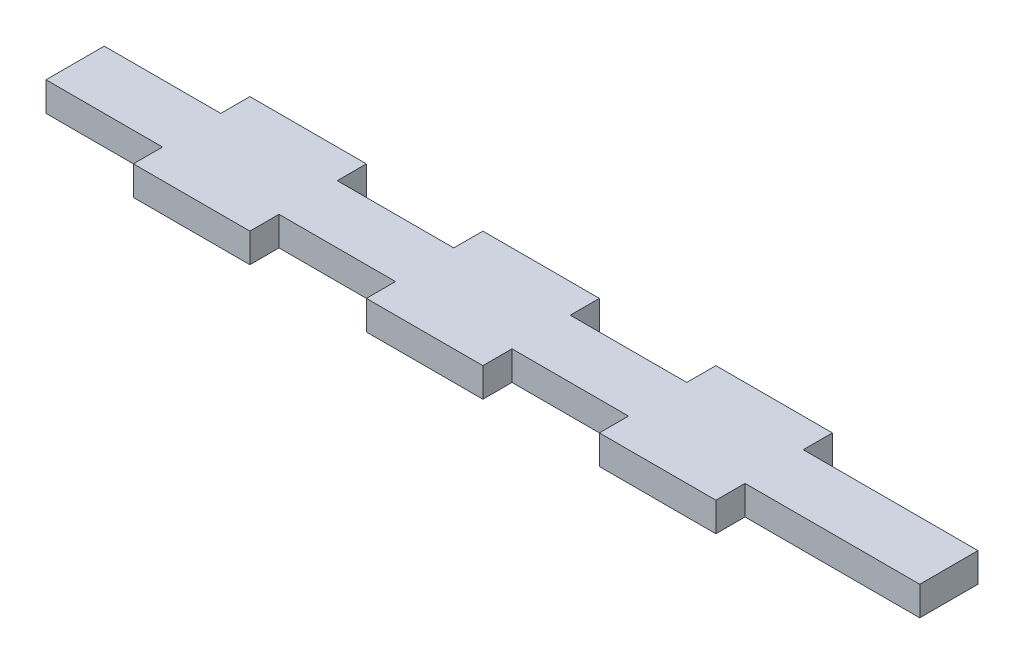
ISO-10303-21;
HEADER;
FILE_DESCRIPTION(('STEP AP214'),'2;1');
FILE_NAME('part.step','',(''),(''),'','','');
FILE_SCHEMA(('AUTOMOTIVE_DESIGN { 1 0 10303 214 1 1 1 1 }'));
ENDSEC;
DATA;
#1=APPLICATION_CONTEXT('core data for automotive mechanical design processes');
#2=APPLICATION_PROTOCOL_DEFINITION('international standard','automotive_design',2000,#1);
#3=PRODUCT_CONTEXT('',#1,'mechanical');
#4=PRODUCT('Part','Part','',(#3));
#5=PRODUCT_RELATED_PRODUCT_CATEGORY('part','',(#4));
#6=PRODUCT_DEFINITION_FORMATION('','',#4);
#7=PRODUCT_DEFINITION_CONTEXT('part definition',#1,'design');
#8=PRODUCT_DEFINITION('design','',#6,#7);
#9=PRODUCT_DEFINITION_SHAPE('','',#8);
#10=(LENGTH_UNIT() NAMED_UNIT(*) SI_UNIT(.MILLI.,.METRE.));
#11=(NAMED_UNIT(*) PLANE_ANGLE_UNIT() SI_UNIT($,.RADIAN.));
#12=(NAMED_UNIT(*) SI_UNIT($,.STERADIAN.) SOLID_ANGLE_UNIT());
#13=UNCERTAINTY_MEASURE_WITH_UNIT(LENGTH_MEASURE(1.E-05),#10,'distance_accuracy_value','');
#14=(GEOMETRIC_REPRESENTATION_CONTEXT(3) GLOBAL_UNCERTAINTY_ASSIGNED_CONTEXT((#13)) GLOBAL_UNIT_ASSIGNED_CONTEXT((#10,
#11,#12)) REPRESENTATION_CONTEXT('',''));
#15=CARTESIAN_POINT('',(0.,0.,0.));
#16=DIRECTION('',(0.,0.,1.));
#17=DIRECTION('',(1.,0.,0.));
#18=AXIS2_PLACEMENT_3D('',#15,#16,#17);
#19=CARTESIAN_POINT('',(0.,0.,12.7));
#20=DIRECTION('',(0.,0.,1.));
#21=DIRECTION('',(1.,0.,0.));
#22=AXIS2_PLACEMENT_3D('',#19,#20,#21);
#23=PLANE('',#22);
#24=DIRECTION('',(0.,1.,0.));
#25=VECTOR('',#24,1.);
#26=CARTESIAN_POINT('',(1.71947391196867,-7.93749999999999,12.7));
#27=LINE('',#26,#25);
#28=CARTESIAN_POINT('',(1.71947391196867,-14.2875,12.7));
#29=VERTEX_POINT('',#28);
#30=CARTESIAN_POINT('',(1.71947391196867,-7.93749999999997,12.7));
#31=VERTEX_POINT('',#30);
#32=EDGE_CURVE('E109',#29,#31,#27,.T.);
#33=ORIENTED_EDGE('',*,*,#32,.T.);
#34=DIRECTION('',(-1.,0.,0.));
#35=VECTOR('',#34,1.);
#36=CARTESIAN_POINT('',(65.2194739119687,-7.93749999999996,12.7));
#37=LINE('',#36,#35);
#38=CARTESIAN_POINT('',(-23.6805260880313,-7.93749999999997,12.7));
#39=VERTEX_POINT('',#38);
#40=EDGE_CURVE('E95',#31,#39,#37,.T.);
#41=ORIENTED_EDGE('',*,*,#40,.T.);
#42=DIRECTION('',(0.,-1.,0.));
#43=VECTOR('',#42,1.);
#44=CARTESIAN_POINT('',(-23.6805260880313,-7.93749999999998,12.7));
#45=LINE('',#44,#43);
#46=CARTESIAN_POINT('',(-23.6805260880313,-14.2875,12.7));
#47=VERTEX_POINT('',#46);
#48=EDGE_CURVE('E320',#39,#47,#45,.T.);
#49=ORIENTED_EDGE('',*,*,#48,.T.);
#50=DIRECTION('',(1.,0.,0.));
#51=VECTOR('',#50,1.);
#52=CARTESIAN_POINT('',(65.2194739119687,-14.2875,12.7));
#53=LINE('',#52,#51);
#54=EDGE_CURVE('E375',#47,#29,#53,.T.);
#55=ORIENTED_EDGE('',*,*,#54,.T.);
#56=EDGE_LOOP('',(#33,#41,#49,#55));
#57=FACE_BOUND('',#56,.T.);
#58=ADVANCED_FACE('F91',(#57),#23,.T.);
#59=DIRECTION('',(0.,1.,0.));
#60=VECTOR('',#59,1.);
#61=CARTESIAN_POINT('',(-49.0805260880313,-7.93749999999998,12.7));
#62=LINE('',#61,#60);
#63=CARTESIAN_POINT('',(-49.0805260880313,-14.2875,12.7));
#64=VERTEX_POINT('',#63);
#65=CARTESIAN_POINT('',(-49.0805260880313,-7.93749999999998,12.7));
#66=VERTEX_POINT('',#65);
#67=EDGE_CURVE('E288',#64,#66,#62,.T.);
#68=ORIENTED_EDGE('',*,*,#67,.T.);
#69=CARTESIAN_POINT('',(-74.4805260880313,-7.93749999999997,12.7));
#70=VERTEX_POINT('',#69);
#71=EDGE_CURVE('E380',#66,#70,#37,.T.);
#72=ORIENTED_EDGE('',*,*,#71,.T.);
#73=DIRECTION('',(0.,-1.,0.));
#74=VECTOR('',#73,1.);
#75=CARTESIAN_POINT('',(-74.4805260880313,-7.93749999999997,12.7));
#76=LINE('',#75,#74);
#77=CARTESIAN_POINT('',(-74.4805260880313,-14.2875,12.7));
#78=VERTEX_POINT('',#77);
#79=EDGE_CURVE('E349',#70,#78,#76,.T.);
#80=ORIENTED_EDGE('',*,*,#79,.T.);
#81=EDGE_CURVE('E378',#78,#64,#53,.T.);
#82=ORIENTED_EDGE('',*,*,#81,.T.);
#83=EDGE_LOOP('',(#68,#72,#80,#82));
#84=FACE_BOUND('',#83,.T.);
#85=ADVANCED_FACE('F619',(#84),#23,.T.);
#86=CARTESIAN_POINT('',(-125.280526088031,-14.2875,12.7));
#87=VERTEX_POINT('',#86);
#88=CARTESIAN_POINT('',(-99.8805260880313,-14.2875,12.7));
#89=VERTEX_POINT('',#88);
#90=EDGE_CURVE('E393',#87,#89,#53,.T.);
#91=ORIENTED_EDGE('',*,*,#90,.T.);
#92=DIRECTION('',(0.,1.,0.));
#93=VECTOR('',#92,1.);
#94=CARTESIAN_POINT('',(-99.8805260880313,-7.93749999999996,12.7));
#95=LINE('',#94,#93);
#96=CARTESIAN_POINT('',(-99.8805260880313,-7.93749999999996,12.7));
#97=VERTEX_POINT('',#96);
#98=EDGE_CURVE('E344',#89,#97,#95,.T.);
#99=ORIENTED_EDGE('',*,*,#98,.T.);
#100=CARTESIAN_POINT('',(-125.280526088031,-7.93749999999999,12.7));
#101=VERTEX_POINT('',#100);
#102=EDGE_CURVE('E397',#97,#101,#37,.T.);
#103=ORIENTED_EDGE('',*,*,#102,.T.);
#104=DIRECTION('',(0.,-1.,0.));
#105=VECTOR('',#104,1.);
#106=CARTESIAN_POINT('',(-125.280526088031,-14.2875,12.7));
#107=LINE('',#106,#105);
#108=EDGE_CURVE('E384',#101,#87,#107,.T.);
#109=ORIENTED_EDGE('',*,*,#108,.T.);
#110=EDGE_LOOP('',(#91,#99,#103,#109));
#111=FACE_BOUND('',#110,.T.);
#112=ADVANCED_FACE('F593',(#111),#23,.T.);
#113=DIRECTION('',(0.,-1.,0.));
#114=VECTOR('',#113,1.);
#115=CARTESIAN_POINT('',(27.1194739119687,-7.93749999999999,12.7));
#116=LINE('',#115,#114);
#117=CARTESIAN_POINT('',(27.1194739119687,-7.93749999999997,12.7));
#118=VERTEX_POINT('',#117);
#119=CARTESIAN_POINT('',(27.1194739119687,-14.2875,12.7));
#120=VERTEX_POINT('',#119);
#121=EDGE_CURVE('E299',#118,#120,#116,.T.);
#122=ORIENTED_EDGE('',*,*,#121,.T.);
#123=CARTESIAN_POINT('',(65.2194739119687,-14.2875,12.7));
#124=VERTEX_POINT('',#123);
#125=EDGE_CURVE('E379',#120,#124,#53,.T.);
#126=ORIENTED_EDGE('',*,*,#125,.T.);
#127=DIRECTION('',(0.,1.,0.));
#128=VECTOR('',#127,1.);
#129=CARTESIAN_POINT('',(65.2194739119687,-14.2875,12.7));
#130=LINE('',#129,#128);
#131=CARTESIAN_POINT('',(65.2194739119687,-7.93749999999996,12.7));
#132=VERTEX_POINT('',#131);
#133=EDGE_CURVE('E399',#124,#132,#130,.T.);
#134=ORIENTED_EDGE('',*,*,#133,.T.);
#135=EDGE_CURVE('E117',#132,#118,#37,.T.);
#136=ORIENTED_EDGE('',*,*,#135,.T.);
#137=EDGE_LOOP('',(#122,#126,#134,#136));
#138=FACE_BOUND('',#137,.T.);
#139=ADVANCED_FACE('F591',(#138),#23,.T.);
#140=CARTESIAN_POINT('',(0.,0.,0.));
#141=DIRECTION('',(0.,0.,1.));
#142=DIRECTION('',(1.,0.,0.));
#143=AXIS2_PLACEMENT_3D('',#140,#141,#142);
#144=PLANE('',#143);
#145=DIRECTION('',(0.,1.,0.));
#146=VECTOR('',#145,1.);
#147=CARTESIAN_POINT('',(1.71947391196867,-7.93749999999995,0.));
#148=LINE('',#147,#146);
#149=CARTESIAN_POINT('',(1.71947391196867,-14.2875,0.));
#150=VERTEX_POINT('',#149);
#151=CARTESIAN_POINT('',(1.71947391196867,-7.93749999999995,0.));
#152=VERTEX_POINT('',#151);
#153=EDGE_CURVE('E371',#150,#152,#148,.T.);
#154=ORIENTED_EDGE('',*,*,#153,.F.);
#155=DIRECTION('',(1.,0.,0.));
#156=VECTOR('',#155,1.);
#157=CARTESIAN_POINT('',(65.2194739119687,-14.2875,0.));
#158=LINE('',#157,#156);
#159=CARTESIAN_POINT('',(-23.6805260880313,-14.2875,0.));
#160=VERTEX_POINT('',#159);
#161=EDGE_CURVE('E445',#160,#150,#158,.T.);
#162=ORIENTED_EDGE('',*,*,#161,.F.);
#163=DIRECTION('',(0.,-1.,0.));
#164=VECTOR('',#163,1.);
#165=CARTESIAN_POINT('',(-23.6805260880313,-7.93749999999996,0.));
#166=LINE('',#165,#164);
#167=CARTESIAN_POINT('',(-23.6805260880313,-7.93749999999996,0.));
#168=VERTEX_POINT('',#167);
#169=EDGE_CURVE('E531',#168,#160,#166,.T.);
#170=ORIENTED_EDGE('',*,*,#169,.F.);
#171=DIRECTION('',(-1.,0.,0.));
#172=VECTOR('',#171,1.);
#173=CARTESIAN_POINT('',(65.2194739119687,-7.93749999999996,0.));
#174=LINE('',#173,#172);
#175=EDGE_CURVE('E485',#152,#168,#174,.T.);
#176=ORIENTED_EDGE('',*,*,#175,.F.);
#177=EDGE_LOOP('',(#154,#162,#170,#176));
#178=FACE_BOUND('',#177,.T.);
#179=ADVANCED_FACE('F568',(#178),#144,.F.);
#180=DIRECTION('',(0.,-1.,0.));
#181=VECTOR('',#180,1.);
#182=CARTESIAN_POINT('',(27.1194739119687,-7.93749999999995,0.));
#183=LINE('',#182,#181);
#184=CARTESIAN_POINT('',(27.1194739119687,-7.93749999999995,0.));
#185=VERTEX_POINT('',#184);
#186=CARTESIAN_POINT('',(27.1194739119687,-14.2875,0.));
#187=VERTEX_POINT('',#186);
#188=EDGE_CURVE('E572',#185,#187,#183,.T.);
#189=ORIENTED_EDGE('',*,*,#188,.F.);
#190=CARTESIAN_POINT('',(65.2194739119687,-7.93749999999996,0.));
#191=VERTEX_POINT('',#190);
#192=EDGE_CURVE('E482',#191,#185,#174,.T.);
#193=ORIENTED_EDGE('',*,*,#192,.F.);
#194=DIRECTION('',(0.,1.,0.));
#195=VECTOR('',#194,1.);
#196=CARTESIAN_POINT('',(65.2194739119687,-14.2875,0.));
#197=LINE('',#196,#195);
#198=CARTESIAN_POINT('',(65.2194739119687,-14.2875,0.));
#199=VERTEX_POINT('',#198);
#200=EDGE_CURVE('E385',#199,#191,#197,.T.);
#201=ORIENTED_EDGE('',*,*,#200,.F.);
#202=EDGE_CURVE('E450',#187,#199,#158,.T.);
#203=ORIENTED_EDGE('',*,*,#202,.F.);
#204=EDGE_LOOP('',(#189,#193,#201,#203));
#205=FACE_BOUND('',#204,.T.);
#206=ADVANCED_FACE('F480',(#205),#144,.F.);
#207=DIRECTION('',(0.,1.,0.));
#208=VECTOR('',#207,1.);
#209=CARTESIAN_POINT('',(-49.0805260880313,-7.93749999999996,0.));
#210=LINE('',#209,#208);
#211=CARTESIAN_POINT('',(-49.0805260880313,-14.2875,0.));
#212=VERTEX_POINT('',#211);
#213=CARTESIAN_POINT('',(-49.0805260880313,-7.93749999999996,0.));
#214=VERTEX_POINT('',#213);
#215=EDGE_CURVE('E528',#212,#214,#210,.T.);
#216=ORIENTED_EDGE('',*,*,#215,.F.);
#217=CARTESIAN_POINT('',(-74.4805260880313,-14.2875,0.));
#218=VERTEX_POINT('',#217);
#219=EDGE_CURVE('E449',#218,#212,#158,.T.);
#220=ORIENTED_EDGE('',*,*,#219,.F.);
#221=DIRECTION('',(0.,-1.,0.));
#222=VECTOR('',#221,1.);
#223=CARTESIAN_POINT('',(-74.4805260880313,-7.93749999999997,0.));
#224=LINE('',#223,#222);
#225=CARTESIAN_POINT('',(-74.4805260880313,-7.93749999999998,0.));
#226=VERTEX_POINT('',#225);
#227=EDGE_CURVE('E413',#226,#218,#224,.T.);
#228=ORIENTED_EDGE('',*,*,#227,.F.);
#229=EDGE_CURVE('E451',#214,#226,#174,.T.);
#230=ORIENTED_EDGE('',*,*,#229,.F.);
#231=EDGE_LOOP('',(#216,#220,#228,#230));
#232=FACE_BOUND('',#231,.T.);
#233=ADVANCED_FACE('F526',(#232),#144,.F.);
#234=DIRECTION('',(0.,1.,0.));
#235=VECTOR('',#234,1.);
#236=CARTESIAN_POINT('',(-99.8805260880313,-7.93749999999996,0.));
#237=LINE('',#236,#235);
#238=CARTESIAN_POINT('',(-99.8805260880313,-14.2875,0.));
#239=VERTEX_POINT('',#238);
#240=CARTESIAN_POINT('',(-99.8805260880313,-7.93749999999998,0.));
#241=VERTEX_POINT('',#240);
#242=EDGE_CURVE('E418',#239,#241,#237,.T.);
#243=ORIENTED_EDGE('',*,*,#242,.F.);
#244=CARTESIAN_POINT('',(-125.280526088031,-14.2875,0.));
#245=VERTEX_POINT('',#244);
#246=EDGE_CURVE('E407',#245,#239,#158,.T.);
#247=ORIENTED_EDGE('',*,*,#246,.F.);
#248=DIRECTION('',(0.,-1.,0.));
#249=VECTOR('',#248,1.);
#250=CARTESIAN_POINT('',(-125.280526088031,-14.2875,0.));
#251=LINE('',#250,#249);
#252=CARTESIAN_POINT('',(-125.280526088031,-7.93749999999999,0.));
#253=VERTEX_POINT('',#252);
#254=EDGE_CURVE('E456',#253,#245,#251,.T.);
#255=ORIENTED_EDGE('',*,*,#254,.F.);
#256=EDGE_CURVE('E419',#241,#253,#174,.T.);
#257=ORIENTED_EDGE('',*,*,#256,.F.);
#258=EDGE_LOOP('',(#243,#247,#255,#257));
#259=FACE_BOUND('',#258,.T.);
#260=ADVANCED_FACE('F501',(#259),#144,.F.);
#261=CARTESIAN_POINT('',(65.2194739119687,-14.2875,12.7));
#262=DIRECTION('',(-1.,0.,0.));
#263=DIRECTION('',(0.,0.,1.));
#264=AXIS2_PLACEMENT_3D('',#261,#262,#263);
#265=PLANE('',#264);
#266=ORIENTED_EDGE('',*,*,#200,.T.);
#267=DIRECTION('',(0.,0.,-1.));
#268=VECTOR('',#267,1.);
#269=CARTESIAN_POINT('',(65.2194739119687,-7.93749999999996,12.7));
#270=LINE('',#269,#268);
#271=EDGE_CURVE('E45',#132,#191,#270,.T.);
#272=ORIENTED_EDGE('',*,*,#271,.F.);
#273=ORIENTED_EDGE('',*,*,#133,.F.);
#274=DIRECTION('',(0.,0.,-1.));
#275=VECTOR('',#274,1.);
#276=CARTESIAN_POINT('',(65.2194739119687,-14.2875,12.7));
#277=LINE('',#276,#275);
#278=EDGE_CURVE('E396',#124,#199,#277,.T.);
#279=ORIENTED_EDGE('',*,*,#278,.T.);
#280=EDGE_LOOP('',(#266,#272,#273,#279));
#281=FACE_BOUND('',#280,.T.);
#282=ADVANCED_FACE('F93',(#281),#265,.F.);
#283=CARTESIAN_POINT('',(65.2194739119687,-7.93749999999996,12.7));
#284=DIRECTION('',(0.,-1.,0.));
#285=DIRECTION('',(1.,0.,0.));
#286=AXIS2_PLACEMENT_3D('',#283,#284,#285);
#287=PLANE('',#286);
#288=ORIENTED_EDGE('',*,*,#192,.T.);
#289=DIRECTION('',(0.,0.,1.));
#290=VECTOR('',#289,1.);
#291=CARTESIAN_POINT('',(27.1194739119687,-7.93749999999995,-6.35));
#292=LINE('',#291,#290);
#293=CARTESIAN_POINT('',(27.1194739119687,-7.93749999999995,-6.35));
#294=VERTEX_POINT('',#293);
#295=EDGE_CURVE('E537',#294,#185,#292,.T.);
#296=ORIENTED_EDGE('',*,*,#295,.F.);
#297=DIRECTION('',(1.,0.,0.));
#298=VECTOR('',#297,1.);
#299=CARTESIAN_POINT('',(1.71947391196867,-7.93749999999995,-6.35));
#300=LINE('',#299,#298);
#301=CARTESIAN_POINT('',(1.71947391196867,-7.93749999999995,-6.35));
#302=VERTEX_POINT('',#301);
#303=EDGE_CURVE('E895',#302,#294,#300,.T.);
#304=ORIENTED_EDGE('',*,*,#303,.F.);
#305=DIRECTION('',(0.,0.,1.));
#306=VECTOR('',#305,1.);
#307=CARTESIAN_POINT('',(1.71947391196867,-7.93749999999995,-6.35));
#308=LINE('',#307,#306);
#309=EDGE_CURVE('E532',#302,#152,#308,.T.);
#310=ORIENTED_EDGE('',*,*,#309,.T.);
#311=ORIENTED_EDGE('',*,*,#175,.T.);
#312=DIRECTION('',(0.,0.,1.));
#313=VECTOR('',#312,1.);
#314=CARTESIAN_POINT('',(-23.6805260880313,-7.93749999999996,-6.35));
#315=LINE('',#314,#313);
#316=CARTESIAN_POINT('',(-23.6805260880313,-7.93749999999996,-6.35));
#317=VERTEX_POINT('',#316);
#318=EDGE_CURVE('E546',#317,#168,#315,.T.);
#319=ORIENTED_EDGE('',*,*,#318,.F.);
#320=DIRECTION('',(1.,0.,0.));
#321=VECTOR('',#320,1.);
#322=CARTESIAN_POINT('',(-49.0805260880313,-7.93749999999996,-6.35));
#323=LINE('',#322,#321);
#324=CARTESIAN_POINT('',(-49.0805260880313,-7.93749999999996,-6.35));
#325=VERTEX_POINT('',#324);
#326=EDGE_CURVE('E551',#325,#317,#323,.T.);
#327=ORIENTED_EDGE('',*,*,#326,.F.);
#328=DIRECTION('',(0.,0.,1.));
#329=VECTOR('',#328,1.);
#330=CARTESIAN_POINT('',(-49.0805260880313,-7.93749999999996,-6.35));
#331=LINE('',#330,#329);
#332=EDGE_CURVE('E439',#325,#214,#331,.T.);
#333=ORIENTED_EDGE('',*,*,#332,.T.);
#334=ORIENTED_EDGE('',*,*,#229,.T.);
#335=DIRECTION('',(0.,0.,1.));
#336=VECTOR('',#335,1.);
#337=CARTESIAN_POINT('',(-74.4805260880313,-7.93749999999997,-6.35));
#338=LINE('',#337,#336);
#339=CARTESIAN_POINT('',(-74.4805260880313,-7.93749999999997,-6.35));
#340=VERTEX_POINT('',#339);
#341=EDGE_CURVE('E424',#340,#226,#338,.T.);
#342=ORIENTED_EDGE('',*,*,#341,.F.);
#343=DIRECTION('',(1.,0.,0.));
#344=VECTOR('',#343,1.);
#345=CARTESIAN_POINT('',(-99.8805260880313,-7.93749999999996,-6.35));
#346=LINE('',#345,#344);
#347=CARTESIAN_POINT('',(-99.8805260880313,-7.93749999999996,-6.35));
#348=VERTEX_POINT('',#347);
#349=EDGE_CURVE('E510',#348,#340,#346,.T.);
#350=ORIENTED_EDGE('',*,*,#349,.F.);
#351=DIRECTION('',(0.,0.,1.));
#352=VECTOR('',#351,1.);
#353=CARTESIAN_POINT('',(-99.8805260880313,-7.93749999999996,-6.35));
#354=LINE('',#353,#352);
#355=EDGE_CURVE('E430',#348,#241,#354,.T.);
#356=ORIENTED_EDGE('',*,*,#355,.T.);
#357=ORIENTED_EDGE('',*,*,#256,.T.);
#358=DIRECTION('',(0.,0.,-1.));
#359=VECTOR('',#358,1.);
#360=CARTESIAN_POINT('',(-125.280526088031,-7.93749999999999,12.7));
#361=LINE('',#360,#359);
#362=EDGE_CURVE('E101',#101,#253,#361,.T.);
#363=ORIENTED_EDGE('',*,*,#362,.F.);
#364=ORIENTED_EDGE('',*,*,#102,.F.);
#365=DIRECTION('',(0.,0.,-1.));
#366=VECTOR('',#365,1.);
#367=CARTESIAN_POINT('',(-99.8805260880313,-7.93749999999996,19.05));
#368=LINE('',#367,#366);
#369=CARTESIAN_POINT('',(-99.8805260880313,-7.93749999999996,19.05));
#370=VERTEX_POINT('',#369);
#371=EDGE_CURVE('E358',#370,#97,#368,.T.);
#372=ORIENTED_EDGE('',*,*,#371,.F.);
#373=DIRECTION('',(1.,0.,0.));
#374=VECTOR('',#373,1.);
#375=CARTESIAN_POINT('',(-99.8805260880313,-7.93749999999996,19.05));
#376=LINE('',#375,#374);
#377=CARTESIAN_POINT('',(-74.4805260880313,-7.93749999999997,19.05));
#378=VERTEX_POINT('',#377);
#379=EDGE_CURVE('E355',#370,#378,#376,.T.);
#380=ORIENTED_EDGE('',*,*,#379,.T.);
#381=DIRECTION('',(0.,0.,-1.));
#382=VECTOR('',#381,1.);
#383=CARTESIAN_POINT('',(-74.4805260880313,-7.93749999999997,19.05));
#384=LINE('',#383,#382);
#385=EDGE_CURVE('E599',#378,#70,#384,.T.);
#386=ORIENTED_EDGE('',*,*,#385,.T.);
#387=ORIENTED_EDGE('',*,*,#71,.F.);
#388=DIRECTION('',(0.,0.,-1.));
#389=VECTOR('',#388,1.);
#390=CARTESIAN_POINT('',(-49.0805260880313,-7.93749999999998,19.05));
#391=LINE('',#390,#389);
#392=CARTESIAN_POINT('',(-49.0805260880313,-7.93749999999998,19.05));
#393=VERTEX_POINT('',#392);
#394=EDGE_CURVE('E329',#393,#66,#391,.T.);
#395=ORIENTED_EDGE('',*,*,#394,.F.);
#396=DIRECTION('',(1.,0.,0.));
#397=VECTOR('',#396,1.);
#398=CARTESIAN_POINT('',(-49.0805260880313,-7.93749999999998,19.05));
#399=LINE('',#398,#397);
#400=CARTESIAN_POINT('',(-23.6805260880313,-7.93749999999998,19.05));
#401=VERTEX_POINT('',#400);
#402=EDGE_CURVE('E326',#393,#401,#399,.T.);
#403=ORIENTED_EDGE('',*,*,#402,.T.);
#404=DIRECTION('',(0.,0.,-1.));
#405=VECTOR('',#404,1.);
#406=CARTESIAN_POINT('',(-23.6805260880313,-7.93749999999998,19.05));
#407=LINE('',#406,#405);
#408=EDGE_CURVE('E335',#401,#39,#407,.T.);
#409=ORIENTED_EDGE('',*,*,#408,.T.);
#410=ORIENTED_EDGE('',*,*,#40,.F.);
#411=DIRECTION('',(0.,0.,-1.));
#412=VECTOR('',#411,1.);
#413=CARTESIAN_POINT('',(1.71947391196867,-7.93749999999999,19.05));
#414=LINE('',#413,#412);
#415=CARTESIAN_POINT('',(1.71947391196867,-7.93749999999999,19.05));
#416=VERTEX_POINT('',#415);
#417=EDGE_CURVE('E309',#416,#31,#414,.T.);
#418=ORIENTED_EDGE('',*,*,#417,.F.);
#419=DIRECTION('',(1.,0.,0.));
#420=VECTOR('',#419,1.);
#421=CARTESIAN_POINT('',(1.71947391196867,-7.93749999999999,19.05));
#422=LINE('',#421,#420);
#423=CARTESIAN_POINT('',(27.1194739119687,-7.93749999999999,19.05));
#424=VERTEX_POINT('',#423);
#425=EDGE_CURVE('E298',#416,#424,#422,.T.);
#426=ORIENTED_EDGE('',*,*,#425,.T.);
#427=DIRECTION('',(0.,0.,-1.));
#428=VECTOR('',#427,1.);
#429=CARTESIAN_POINT('',(27.1194739119687,-7.93749999999999,19.05));
#430=LINE('',#429,#428);
#431=EDGE_CURVE('E313',#424,#118,#430,.T.);
#432=ORIENTED_EDGE('',*,*,#431,.T.);
#433=ORIENTED_EDGE('',*,*,#135,.F.);
#434=ORIENTED_EDGE('',*,*,#271,.T.);
#435=EDGE_LOOP('',(#288,#296,#304,#310,#311,#319,#327,#333,#334,#342,#350,#356,#357,#363,#364,
#372,#380,#386,#387,#395,#403,#409,#410,#418,#426,#432,#433,#434));
#436=FACE_BOUND('',#435,.T.);
#437=ADVANCED_FACE('F550',(#436),#287,.F.);
#438=CARTESIAN_POINT('',(-125.280526088031,-14.2875,12.7));
#439=DIRECTION('',(1.,0.,0.));
#440=DIRECTION('',(0.,0.,-1.));
#441=AXIS2_PLACEMENT_3D('',#438,#439,#440);
#442=PLANE('',#441);
#443=ORIENTED_EDGE('',*,*,#254,.T.);
#444=DIRECTION('',(0.,0.,-1.));
#445=VECTOR('',#444,1.);
#446=CARTESIAN_POINT('',(-125.280526088031,-14.2875,12.7));
#447=LINE('',#446,#445);
#448=EDGE_CURVE('E465',#87,#245,#447,.T.);
#449=ORIENTED_EDGE('',*,*,#448,.F.);
#450=ORIENTED_EDGE('',*,*,#108,.F.);
#451=ORIENTED_EDGE('',*,*,#362,.T.);
#452=EDGE_LOOP('',(#443,#449,#450,#451));
#453=FACE_BOUND('',#452,.T.);
#454=ADVANCED_FACE('F498',(#453),#442,.F.);
#455=CARTESIAN_POINT('',(65.2194739119687,-14.2875,12.7));
#456=DIRECTION('',(0.,1.,0.));
#457=DIRECTION('',(-1.,0.,0.));
#458=AXIS2_PLACEMENT_3D('',#455,#456,#457);
#459=PLANE('',#458);
#460=ORIENTED_EDGE('',*,*,#246,.T.);
#461=DIRECTION('',(0.,0.,1.));
#462=VECTOR('',#461,1.);
#463=CARTESIAN_POINT('',(-99.8805260880313,-14.2875,-6.35));
#464=LINE('',#463,#462);
#465=CARTESIAN_POINT('',(-99.8805260880313,-14.2875,-6.35));
#466=VERTEX_POINT('',#465);
#467=EDGE_CURVE('E425',#466,#239,#464,.T.);
#468=ORIENTED_EDGE('',*,*,#467,.F.);
#469=DIRECTION('',(-1.,0.,0.));
#470=VECTOR('',#469,1.);
#471=CARTESIAN_POINT('',(-99.8805260880313,-14.2875,-6.35));
#472=LINE('',#471,#470);
#473=CARTESIAN_POINT('',(-74.4805260880313,-14.2875,-6.35));
#474=VERTEX_POINT('',#473);
#475=EDGE_CURVE('E442',#474,#466,#472,.T.);
#476=ORIENTED_EDGE('',*,*,#475,.F.);
#477=DIRECTION('',(0.,0.,1.));
#478=VECTOR('',#477,1.);
#479=CARTESIAN_POINT('',(-74.4805260880313,-14.2875,-6.35));
#480=LINE('',#479,#478);
#481=EDGE_CURVE('E421',#474,#218,#480,.T.);
#482=ORIENTED_EDGE('',*,*,#481,.T.);
#483=ORIENTED_EDGE('',*,*,#219,.T.);
#484=DIRECTION('',(0.,0.,1.));
#485=VECTOR('',#484,1.);
#486=CARTESIAN_POINT('',(-49.0805260880313,-14.2875,-6.35));
#487=LINE('',#486,#485);
#488=CARTESIAN_POINT('',(-49.0805260880313,-14.2875,-6.35));
#489=VERTEX_POINT('',#488);
#490=EDGE_CURVE('E543',#489,#212,#487,.T.);
#491=ORIENTED_EDGE('',*,*,#490,.F.);
#492=DIRECTION('',(-1.,0.,0.));
#493=VECTOR('',#492,1.);
#494=CARTESIAN_POINT('',(-49.0805260880313,-14.2875,-6.35));
#495=LINE('',#494,#493);
#496=CARTESIAN_POINT('',(-23.6805260880313,-14.2875,-6.35));
#497=VERTEX_POINT('',#496);
#498=EDGE_CURVE('E540',#497,#489,#495,.T.);
#499=ORIENTED_EDGE('',*,*,#498,.F.);
#500=DIRECTION('',(0.,0.,1.));
#501=VECTOR('',#500,1.);
#502=CARTESIAN_POINT('',(-23.6805260880313,-14.2875,-6.35));
#503=LINE('',#502,#501);
#504=EDGE_CURVE('E545',#497,#160,#503,.T.);
#505=ORIENTED_EDGE('',*,*,#504,.T.);
#506=ORIENTED_EDGE('',*,*,#161,.T.);
#507=DIRECTION('',(0.,0.,1.));
#508=VECTOR('',#507,1.);
#509=CARTESIAN_POINT('',(1.71947391196867,-14.2875,-6.35));
#510=LINE('',#509,#508);
#511=CARTESIAN_POINT('',(1.71947391196867,-14.2875,-6.35));
#512=VERTEX_POINT('',#511);
#513=EDGE_CURVE('E581',#512,#150,#510,.T.);
#514=ORIENTED_EDGE('',*,*,#513,.F.);
#515=DIRECTION('',(-1.,0.,0.));
#516=VECTOR('',#515,1.);
#517=CARTESIAN_POINT('',(1.71947391196867,-14.2875,-6.35));
#518=LINE('',#517,#516);
#519=CARTESIAN_POINT('',(27.1194739119687,-14.2875,-6.35));
#520=VERTEX_POINT('',#519);
#521=EDGE_CURVE('E578',#520,#512,#518,.T.);
#522=ORIENTED_EDGE('',*,*,#521,.F.);
#523=DIRECTION('',(0.,0.,1.));
#524=VECTOR('',#523,1.);
#525=CARTESIAN_POINT('',(27.1194739119687,-14.2875,-6.35));
#526=LINE('',#525,#524);
#527=EDGE_CURVE('E583',#520,#187,#526,.T.);
#528=ORIENTED_EDGE('',*,*,#527,.T.);
#529=ORIENTED_EDGE('',*,*,#202,.T.);
#530=ORIENTED_EDGE('',*,*,#278,.F.);
#531=ORIENTED_EDGE('',*,*,#125,.F.);
#532=DIRECTION('',(0.,0.,-1.));
#533=VECTOR('',#532,1.);
#534=CARTESIAN_POINT('',(27.1194739119687,-14.2875,19.05));
#535=LINE('',#534,#533);
#536=CARTESIAN_POINT('',(27.1194739119687,-14.2875,19.05));
#537=VERTEX_POINT('',#536);
#538=EDGE_CURVE('E289',#537,#120,#535,.T.);
#539=ORIENTED_EDGE('',*,*,#538,.F.);
#540=DIRECTION('',(-1.,0.,0.));
#541=VECTOR('',#540,1.);
#542=CARTESIAN_POINT('',(1.71947391196867,-14.2875,19.05));
#543=LINE('',#542,#541);
#544=CARTESIAN_POINT('',(1.71947391196867,-14.2875,19.05));
#545=VERTEX_POINT('',#544);
#546=EDGE_CURVE('E295',#537,#545,#543,.T.);
#547=ORIENTED_EDGE('',*,*,#546,.T.);
#548=DIRECTION('',(0.,0.,-1.));
#549=VECTOR('',#548,1.);
#550=CARTESIAN_POINT('',(1.71947391196867,-14.2875,19.05));
#551=LINE('',#550,#549);
#552=EDGE_CURVE('E280',#545,#29,#551,.T.);
#553=ORIENTED_EDGE('',*,*,#552,.T.);
#554=ORIENTED_EDGE('',*,*,#54,.F.);
#555=DIRECTION('',(0.,0.,-1.));
#556=VECTOR('',#555,1.);
#557=CARTESIAN_POINT('',(-23.6805260880313,-14.2875,19.05));
#558=LINE('',#557,#556);
#559=CARTESIAN_POINT('',(-23.6805260880313,-14.2875,19.05));
#560=VERTEX_POINT('',#559);
#561=EDGE_CURVE('E338',#560,#47,#558,.T.);
#562=ORIENTED_EDGE('',*,*,#561,.F.);
#563=DIRECTION('',(-1.,0.,0.));
#564=VECTOR('',#563,1.);
#565=CARTESIAN_POINT('',(-49.0805260880313,-14.2875,19.05));
#566=LINE('',#565,#564);
#567=CARTESIAN_POINT('',(-49.0805260880313,-14.2875,19.05));
#568=VERTEX_POINT('',#567);
#569=EDGE_CURVE('E319',#560,#568,#566,.T.);
#570=ORIENTED_EDGE('',*,*,#569,.T.);
#571=DIRECTION('',(0.,0.,-1.));
#572=VECTOR('',#571,1.);
#573=CARTESIAN_POINT('',(-49.0805260880313,-14.2875,19.05));
#574=LINE('',#573,#572);
#575=EDGE_CURVE('E341',#568,#64,#574,.T.);
#576=ORIENTED_EDGE('',*,*,#575,.T.);
#577=ORIENTED_EDGE('',*,*,#81,.F.);
#578=DIRECTION('',(0.,0.,-1.));
#579=VECTOR('',#578,1.);
#580=CARTESIAN_POINT('',(-74.4805260880313,-14.2875,19.05));
#581=LINE('',#580,#579);
#582=CARTESIAN_POINT('',(-74.4805260880313,-14.2875,19.05));
#583=VERTEX_POINT('',#582);
#584=EDGE_CURVE('E372',#583,#78,#581,.T.);
#585=ORIENTED_EDGE('',*,*,#584,.F.);
#586=DIRECTION('',(-1.,0.,0.));
#587=VECTOR('',#586,1.);
#588=CARTESIAN_POINT('',(-99.8805260880313,-14.2875,19.05));
#589=LINE('',#588,#587);
#590=CARTESIAN_POINT('',(-99.8805260880313,-14.2875,19.05));
#591=VERTEX_POINT('',#590);
#592=EDGE_CURVE('E348',#583,#591,#589,.T.);
#593=ORIENTED_EDGE('',*,*,#592,.T.);
#594=DIRECTION('',(0.,0.,-1.));
#595=VECTOR('',#594,1.);
#596=CARTESIAN_POINT('',(-99.8805260880313,-14.2875,19.05));
#597=LINE('',#596,#595);
#598=EDGE_CURVE('E369',#591,#89,#597,.T.);
#599=ORIENTED_EDGE('',*,*,#598,.T.);
#600=ORIENTED_EDGE('',*,*,#90,.F.);
#601=ORIENTED_EDGE('',*,*,#448,.T.);
#602=EDGE_LOOP('',(#460,#468,#476,#482,#483,#491,#499,#505,#506,#514,#522,#528,#529,#530,#531,
#539,#547,#553,#554,#562,#570,#576,#577,#585,#593,#599,#600,#601));
#603=FACE_BOUND('',#602,.T.);
#604=ADVANCED_FACE('F302',(#603),#459,.F.);
#605=CARTESIAN_POINT('',(-99.8805260880313,-7.93749999999996,-6.35));
#606=DIRECTION('',(1.,0.,0.));
#607=DIRECTION('',(0.,0.,-1.));
#608=AXIS2_PLACEMENT_3D('',#605,#606,#607);
#609=PLANE('',#608);
#610=ORIENTED_EDGE('',*,*,#242,.T.);
#611=ORIENTED_EDGE('',*,*,#355,.F.);
#612=DIRECTION('',(0.,1.,0.));
#613=VECTOR('',#612,1.);
#614=CARTESIAN_POINT('',(-99.8805260880313,-7.93749999999996,-6.35));
#615=LINE('',#614,#613);
#616=EDGE_CURVE('E417',#466,#348,#615,.T.);
#617=ORIENTED_EDGE('',*,*,#616,.F.);
#618=ORIENTED_EDGE('',*,*,#467,.T.);
#619=EDGE_LOOP('',(#610,#611,#617,#618));
#620=FACE_BOUND('',#619,.T.);
#621=ADVANCED_FACE('F506',(#620),#609,.F.);
#622=CARTESIAN_POINT('',(-74.4805260880313,-7.93749999999997,-6.35));
#623=DIRECTION('',(-1.,0.,0.));
#624=DIRECTION('',(0.,0.,1.));
#625=AXIS2_PLACEMENT_3D('',#622,#623,#624);
#626=PLANE('',#625);
#627=ORIENTED_EDGE('',*,*,#227,.T.);
#628=ORIENTED_EDGE('',*,*,#481,.F.);
#629=DIRECTION('',(0.,-1.,0.));
#630=VECTOR('',#629,1.);
#631=CARTESIAN_POINT('',(-74.4805260880313,-7.93749999999997,-6.35));
#632=LINE('',#631,#630);
#633=EDGE_CURVE('E512',#340,#474,#632,.T.);
#634=ORIENTED_EDGE('',*,*,#633,.F.);
#635=ORIENTED_EDGE('',*,*,#341,.T.);
#636=EDGE_LOOP('',(#627,#628,#634,#635));
#637=FACE_BOUND('',#636,.T.);
#638=ADVANCED_FACE('F523',(#637),#626,.F.);
#639=CARTESIAN_POINT('',(0.,0.,-6.35));
#640=DIRECTION('',(0.,0.,1.));
#641=DIRECTION('',(1.,0.,0.));
#642=AXIS2_PLACEMENT_3D('',#639,#640,#641);
#643=PLANE('',#642);
#644=ORIENTED_EDGE('',*,*,#616,.T.);
#645=ORIENTED_EDGE('',*,*,#349,.T.);
#646=ORIENTED_EDGE('',*,*,#633,.T.);
#647=ORIENTED_EDGE('',*,*,#475,.T.);
#648=EDGE_LOOP('',(#644,#645,#646,#647));
#649=FACE_BOUND('',#648,.T.);
#650=ADVANCED_FACE('F517',(#649),#643,.F.);
#651=CARTESIAN_POINT('',(-49.0805260880313,-7.93749999999996,-6.35));
#652=DIRECTION('',(1.,0.,0.));
#653=DIRECTION('',(0.,0.,-1.));
#654=AXIS2_PLACEMENT_3D('',#651,#652,#653);
#655=PLANE('',#654);
#656=ORIENTED_EDGE('',*,*,#215,.T.);
#657=ORIENTED_EDGE('',*,*,#332,.F.);
#658=DIRECTION('',(0.,1.,0.));
#659=VECTOR('',#658,1.);
#660=CARTESIAN_POINT('',(-49.0805260880313,-7.93749999999996,-6.35));
#661=LINE('',#660,#659);
#662=EDGE_CURVE('E535',#489,#325,#661,.T.);
#663=ORIENTED_EDGE('',*,*,#662,.F.);
#664=ORIENTED_EDGE('',*,*,#490,.T.);
#665=EDGE_LOOP('',(#656,#657,#663,#664));
#666=FACE_BOUND('',#665,.T.);
#667=ADVANCED_FACE('F554',(#666),#655,.F.);
#668=CARTESIAN_POINT('',(-23.6805260880313,-7.93749999999996,-6.35));
#669=DIRECTION('',(-1.,0.,0.));
#670=DIRECTION('',(0.,0.,1.));
#671=AXIS2_PLACEMENT_3D('',#668,#669,#670);
#672=PLANE('',#671);
#673=ORIENTED_EDGE('',*,*,#169,.T.);
#674=ORIENTED_EDGE('',*,*,#504,.F.);
#675=DIRECTION('',(0.,-1.,0.));
#676=VECTOR('',#675,1.);
#677=CARTESIAN_POINT('',(-23.6805260880313,-7.93749999999996,-6.35));
#678=LINE('',#677,#676);
#679=EDGE_CURVE('E557',#317,#497,#678,.T.);
#680=ORIENTED_EDGE('',*,*,#679,.F.);
#681=ORIENTED_EDGE('',*,*,#318,.T.);
#682=EDGE_LOOP('',(#673,#674,#680,#681));
#683=FACE_BOUND('',#682,.T.);
#684=ADVANCED_FACE('F565',(#683),#672,.F.);
#685=CARTESIAN_POINT('',(50.8,0.,-6.35));
#686=DIRECTION('',(0.,0.,1.));
#687=DIRECTION('',(1.,0.,0.));
#688=AXIS2_PLACEMENT_3D('',#685,#686,#687);
#689=PLANE('',#688);
#690=ORIENTED_EDGE('',*,*,#662,.T.);
#691=ORIENTED_EDGE('',*,*,#326,.T.);
#692=ORIENTED_EDGE('',*,*,#679,.T.);
#693=ORIENTED_EDGE('',*,*,#498,.T.);
#694=EDGE_LOOP('',(#690,#691,#692,#693));
#695=FACE_BOUND('',#694,.T.);
#696=ADVANCED_FACE('F562',(#695),#689,.F.);
#697=CARTESIAN_POINT('',(1.71947391196867,-7.93749999999995,-6.35));
#698=DIRECTION('',(1.,0.,0.));
#699=DIRECTION('',(0.,0.,-1.));
#700=AXIS2_PLACEMENT_3D('',#697,#698,#699);
#701=PLANE('',#700);
#702=ORIENTED_EDGE('',*,*,#153,.T.);
#703=ORIENTED_EDGE('',*,*,#309,.F.);
#704=DIRECTION('',(0.,1.,0.));
#705=VECTOR('',#704,1.);
#706=CARTESIAN_POINT('',(1.71947391196867,-7.93749999999995,-6.35));
#707=LINE('',#706,#705);
#708=EDGE_CURVE('E575',#512,#302,#707,.T.);
#709=ORIENTED_EDGE('',*,*,#708,.F.);
#710=ORIENTED_EDGE('',*,*,#513,.T.);
#711=EDGE_LOOP('',(#702,#703,#709,#710));
#712=FACE_BOUND('',#711,.T.);
#713=ADVANCED_FACE('F700',(#712),#701,.F.);
#714=CARTESIAN_POINT('',(27.1194739119687,-7.93749999999995,-6.35));
#715=DIRECTION('',(-1.,0.,0.));
#716=DIRECTION('',(0.,0.,1.));
#717=AXIS2_PLACEMENT_3D('',#714,#715,#716);
#718=PLANE('',#717);
#719=ORIENTED_EDGE('',*,*,#188,.T.);
#720=ORIENTED_EDGE('',*,*,#527,.F.);
#721=DIRECTION('',(0.,-1.,0.));
#722=VECTOR('',#721,1.);
#723=CARTESIAN_POINT('',(27.1194739119687,-7.93749999999995,-6.35));
#724=LINE('',#723,#722);
#725=EDGE_CURVE('E589',#294,#520,#724,.T.);
#726=ORIENTED_EDGE('',*,*,#725,.F.);
#727=ORIENTED_EDGE('',*,*,#295,.T.);
#728=EDGE_LOOP('',(#719,#720,#726,#727));
#729=FACE_BOUND('',#728,.T.);
#730=ADVANCED_FACE('F587',(#729),#718,.F.);
#731=CARTESIAN_POINT('',(101.6,0.,-6.35));
#732=DIRECTION('',(0.,0.,1.));
#733=DIRECTION('',(1.,0.,0.));
#734=AXIS2_PLACEMENT_3D('',#731,#732,#733);
#735=PLANE('',#734);
#736=ORIENTED_EDGE('',*,*,#708,.T.);
#737=ORIENTED_EDGE('',*,*,#303,.T.);
#738=ORIENTED_EDGE('',*,*,#725,.T.);
#739=ORIENTED_EDGE('',*,*,#521,.T.);
#740=EDGE_LOOP('',(#736,#737,#738,#739));
#741=FACE_BOUND('',#740,.T.);
#742=ADVANCED_FACE('F716',(#741),#735,.F.);
#743=CARTESIAN_POINT('',(-99.8805260880313,-7.93749999999996,19.05));
#744=DIRECTION('',(-1.,0.,0.));
#745=DIRECTION('',(0.,0.,1.));
#746=AXIS2_PLACEMENT_3D('',#743,#744,#745);
#747=PLANE('',#746);
#748=ORIENTED_EDGE('',*,*,#98,.F.);
#749=ORIENTED_EDGE('',*,*,#598,.F.);
#750=DIRECTION('',(0.,1.,0.));
#751=VECTOR('',#750,1.);
#752=CARTESIAN_POINT('',(-99.8805260880313,-7.93749999999996,19.05));
#753=LINE('',#752,#751);
#754=EDGE_CURVE('E345',#591,#370,#753,.T.);
#755=ORIENTED_EDGE('',*,*,#754,.T.);
#756=ORIENTED_EDGE('',*,*,#371,.T.);
#757=EDGE_LOOP('',(#748,#749,#755,#756));
#758=FACE_BOUND('',#757,.T.);
#759=ADVANCED_FACE('F601',(#758),#747,.T.);
#760=CARTESIAN_POINT('',(-74.4805260880313,-7.93749999999997,19.05));
#761=DIRECTION('',(1.,0.,0.));
#762=DIRECTION('',(0.,0.,-1.));
#763=AXIS2_PLACEMENT_3D('',#760,#761,#762);
#764=PLANE('',#763);
#765=ORIENTED_EDGE('',*,*,#79,.F.);
#766=ORIENTED_EDGE('',*,*,#385,.F.);
#767=DIRECTION('',(0.,-1.,0.));
#768=VECTOR('',#767,1.);
#769=CARTESIAN_POINT('',(-74.4805260880313,-7.93749999999997,19.05));
#770=LINE('',#769,#768);
#771=EDGE_CURVE('E352',#378,#583,#770,.T.);
#772=ORIENTED_EDGE('',*,*,#771,.T.);
#773=ORIENTED_EDGE('',*,*,#584,.T.);
#774=EDGE_LOOP('',(#765,#766,#772,#773));
#775=FACE_BOUND('',#774,.T.);
#776=ADVANCED_FACE('F608',(#775),#764,.T.);
#777=CARTESIAN_POINT('',(0.,0.,19.05));
#778=DIRECTION('',(0.,0.,-1.));
#779=DIRECTION('',(1.,0.,0.));
#780=AXIS2_PLACEMENT_3D('',#777,#778,#779);
#781=PLANE('',#780);
#782=ORIENTED_EDGE('',*,*,#754,.F.);
#783=ORIENTED_EDGE('',*,*,#592,.F.);
#784=ORIENTED_EDGE('',*,*,#771,.F.);
#785=ORIENTED_EDGE('',*,*,#379,.F.);
#786=EDGE_LOOP('',(#782,#783,#784,#785));
#787=FACE_BOUND('',#786,.T.);
#788=ADVANCED_FACE('F605',(#787),#781,.F.);
#789=CARTESIAN_POINT('',(-49.0805260880313,-7.93749999999998,19.05));
#790=DIRECTION('',(-1.,0.,0.));
#791=DIRECTION('',(0.,0.,1.));
#792=AXIS2_PLACEMENT_3D('',#789,#790,#791);
#793=PLANE('',#792);
#794=ORIENTED_EDGE('',*,*,#67,.F.);
#795=ORIENTED_EDGE('',*,*,#575,.F.);
#796=DIRECTION('',(0.,1.,0.));
#797=VECTOR('',#796,1.);
#798=CARTESIAN_POINT('',(-49.0805260880313,-7.93749999999998,19.05));
#799=LINE('',#798,#797);
#800=EDGE_CURVE('E316',#568,#393,#799,.T.);
#801=ORIENTED_EDGE('',*,*,#800,.T.);
#802=ORIENTED_EDGE('',*,*,#394,.T.);
#803=EDGE_LOOP('',(#794,#795,#801,#802));
#804=FACE_BOUND('',#803,.T.);
#805=ADVANCED_FACE('F624',(#804),#793,.T.);
#806=CARTESIAN_POINT('',(-23.6805260880313,-7.93749999999998,19.05));
#807=DIRECTION('',(1.,0.,0.));
#808=DIRECTION('',(0.,0.,-1.));
#809=AXIS2_PLACEMENT_3D('',#806,#807,#808);
#810=PLANE('',#809);
#811=ORIENTED_EDGE('',*,*,#48,.F.);
#812=ORIENTED_EDGE('',*,*,#408,.F.);
#813=DIRECTION('',(0.,-1.,0.));
#814=VECTOR('',#813,1.);
#815=CARTESIAN_POINT('',(-23.6805260880313,-7.93749999999998,19.05));
#816=LINE('',#815,#814);
#817=EDGE_CURVE('E323',#401,#560,#816,.T.);
#818=ORIENTED_EDGE('',*,*,#817,.T.);
#819=ORIENTED_EDGE('',*,*,#561,.T.);
#820=EDGE_LOOP('',(#811,#812,#818,#819));
#821=FACE_BOUND('',#820,.T.);
#822=ADVANCED_FACE('F629',(#821),#810,.T.);
#823=CARTESIAN_POINT('',(50.8,0.,19.05));
#824=DIRECTION('',(0.,0.,-1.));
#825=DIRECTION('',(1.,0.,0.));
#826=AXIS2_PLACEMENT_3D('',#823,#824,#825);
#827=PLANE('',#826);
#828=ORIENTED_EDGE('',*,*,#800,.F.);
#829=ORIENTED_EDGE('',*,*,#569,.F.);
#830=ORIENTED_EDGE('',*,*,#817,.F.);
#831=ORIENTED_EDGE('',*,*,#402,.F.);
#832=EDGE_LOOP('',(#828,#829,#830,#831));
#833=FACE_BOUND('',#832,.T.);
#834=ADVANCED_FACE('F631',(#833),#827,.F.);
#835=CARTESIAN_POINT('',(1.71947391196867,-7.93749999999999,19.05));
#836=DIRECTION('',(-1.,0.,0.));
#837=DIRECTION('',(0.,0.,1.));
#838=AXIS2_PLACEMENT_3D('',#835,#836,#837);
#839=PLANE('',#838);
#840=ORIENTED_EDGE('',*,*,#32,.F.);
#841=ORIENTED_EDGE('',*,*,#552,.F.);
#842=DIRECTION('',(0.,1.,0.));
#843=VECTOR('',#842,1.);
#844=CARTESIAN_POINT('',(1.71947391196867,-7.93749999999999,19.05));
#845=LINE('',#844,#843);
#846=EDGE_CURVE('E284',#545,#416,#845,.T.);
#847=ORIENTED_EDGE('',*,*,#846,.T.);
#848=ORIENTED_EDGE('',*,*,#417,.T.);
#849=EDGE_LOOP('',(#840,#841,#847,#848));
#850=FACE_BOUND('',#849,.T.);
#851=ADVANCED_FACE('F282',(#850),#839,.T.);
#852=CARTESIAN_POINT('',(27.1194739119687,-7.93749999999999,19.05));
#853=DIRECTION('',(1.,0.,0.));
#854=DIRECTION('',(0.,0.,-1.));
#855=AXIS2_PLACEMENT_3D('',#852,#853,#854);
#856=PLANE('',#855);
#857=ORIENTED_EDGE('',*,*,#121,.F.);
#858=ORIENTED_EDGE('',*,*,#431,.F.);
#859=DIRECTION('',(0.,-1.,0.));
#860=VECTOR('',#859,1.);
#861=CARTESIAN_POINT('',(27.1194739119687,-7.93749999999999,19.05));
#862=LINE('',#861,#860);
#863=EDGE_CURVE('E304',#424,#537,#862,.T.);
#864=ORIENTED_EDGE('',*,*,#863,.T.);
#865=ORIENTED_EDGE('',*,*,#538,.T.);
#866=EDGE_LOOP('',(#857,#858,#864,#865));
#867=FACE_BOUND('',#866,.T.);
#868=ADVANCED_FACE('F638',(#867),#856,.T.);
#869=CARTESIAN_POINT('',(101.6,0.,19.05));
#870=DIRECTION('',(0.,0.,-1.));
#871=DIRECTION('',(1.,0.,0.));
#872=AXIS2_PLACEMENT_3D('',#869,#870,#871);
#873=PLANE('',#872);
#874=ORIENTED_EDGE('',*,*,#846,.F.);
#875=ORIENTED_EDGE('',*,*,#546,.F.);
#876=ORIENTED_EDGE('',*,*,#863,.F.);
#877=ORIENTED_EDGE('',*,*,#425,.F.);
#878=EDGE_LOOP('',(#874,#875,#876,#877));
#879=FACE_BOUND('',#878,.T.);
#880=ADVANCED_FACE('F293',(#879),#873,.F.);
#881=CLOSED_SHELL('',(#58,#85,#112,#139,#179,#206,#233,#260,#282,#437,#454,#604,#621,#638,#650,
#667,#684,#696,#713,#730,#742,#759,#776,#788,#805,#822,#834,#851,#868,#880));
#882=MANIFOLD_SOLID_BREP('B6',#881);
#883=ADVANCED_BREP_SHAPE_REPRESENTATION('',(#18,#882),#14);
#884=SHAPE_DEFINITION_REPRESENTATION(#9,#883);
ENDSEC;
END-ISO-10303-21;
